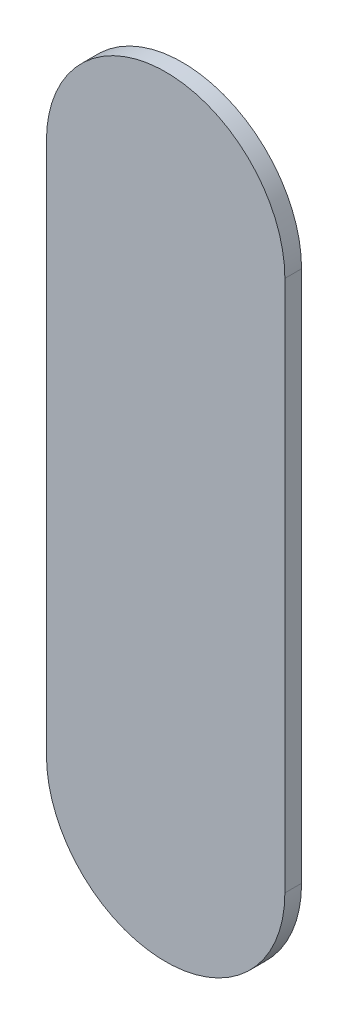
ISO-10303-21;
HEADER;
FILE_DESCRIPTION(('STEP AP214'),'2;1');
FILE_NAME('part.step','',(''),(''),'','','');
FILE_SCHEMA(('AUTOMOTIVE_DESIGN { 1 0 10303 214 1 1 1 1 }'));
ENDSEC;
DATA;
#1=APPLICATION_CONTEXT('core data for automotive mechanical design processes');
#2=APPLICATION_PROTOCOL_DEFINITION('international standard','automotive_design',2000,#1);
#3=PRODUCT_CONTEXT('',#1,'mechanical');
#4=PRODUCT('Part','Part','',(#3));
#5=PRODUCT_RELATED_PRODUCT_CATEGORY('part','',(#4));
#6=PRODUCT_DEFINITION_FORMATION('','',#4);
#7=PRODUCT_DEFINITION_CONTEXT('part definition',#1,'design');
#8=PRODUCT_DEFINITION('design','',#6,#7);
#9=PRODUCT_DEFINITION_SHAPE('','',#8);
#10=(LENGTH_UNIT() NAMED_UNIT(*) SI_UNIT(.MILLI.,.METRE.));
#11=(NAMED_UNIT(*) PLANE_ANGLE_UNIT() SI_UNIT($,.RADIAN.));
#12=(NAMED_UNIT(*) SI_UNIT($,.STERADIAN.) SOLID_ANGLE_UNIT());
#13=UNCERTAINTY_MEASURE_WITH_UNIT(LENGTH_MEASURE(1.E-05),#10,'distance_accuracy_value','');
#14=(GEOMETRIC_REPRESENTATION_CONTEXT(3) GLOBAL_UNCERTAINTY_ASSIGNED_CONTEXT((#13)) GLOBAL_UNIT_ASSIGNED_CONTEXT((#10,
#11,#12)) REPRESENTATION_CONTEXT('',''));
#15=CARTESIAN_POINT('',(0.,0.,0.));
#16=DIRECTION('',(0.,0.,1.));
#17=DIRECTION('',(1.,0.,0.));
#18=AXIS2_PLACEMENT_3D('',#15,#16,#17);
#19=CARTESIAN_POINT('',(109.669,-72.989,1.635));
#20=DIRECTION('',(0.,0.,1.));
#21=DIRECTION('',(1.,0.,0.));
#22=AXIS2_PLACEMENT_3D('',#19,#20,#21);
#23=PLANE('',#22);
#24=DIRECTION('',(0.,-1.,0.));
#25=VECTOR('',#24,1.);
#26=CARTESIAN_POINT('',(109.669,-72.989,1.635));
#27=LINE('',#26,#25);
#28=CARTESIAN_POINT('',(109.669,-72.989,1.635));
#29=VERTEX_POINT('',#28);
#30=CARTESIAN_POINT('',(109.669,-74.105,1.635));
#31=VERTEX_POINT('',#30);
#32=EDGE_CURVE('E82',#29,#31,#27,.T.);
#33=ORIENTED_EDGE('',*,*,#32,.T.);
#34=CARTESIAN_POINT('',(109.919,-74.105,1.635));
#35=DIRECTION('',(0.,0.,1.));
#36=DIRECTION('',(-1.,0.,0.));
#37=AXIS2_PLACEMENT_3D('',#34,#35,#36);
#38=CIRCLE('',#37,0.25);
#39=CARTESIAN_POINT('',(110.169,-74.105,1.635));
#40=VERTEX_POINT('',#39);
#41=EDGE_CURVE('E107',#31,#40,#38,.T.);
#42=ORIENTED_EDGE('',*,*,#41,.T.);
#43=DIRECTION('',(0.,1.,0.));
#44=VECTOR('',#43,1.);
#45=CARTESIAN_POINT('',(110.169,-74.105,1.635));
#46=LINE('',#45,#44);
#47=CARTESIAN_POINT('',(110.169,-72.989,1.635));
#48=VERTEX_POINT('',#47);
#49=EDGE_CURVE('E74',#40,#48,#46,.T.);
#50=ORIENTED_EDGE('',*,*,#49,.T.);
#51=CARTESIAN_POINT('',(109.919,-72.989,1.635));
#52=DIRECTION('',(0.,0.,1.));
#53=DIRECTION('',(1.,0.,0.));
#54=AXIS2_PLACEMENT_3D('',#51,#52,#53);
#55=CIRCLE('',#54,0.25);
#56=EDGE_CURVE('E11',#48,#29,#55,.T.);
#57=ORIENTED_EDGE('',*,*,#56,.T.);
#58=EDGE_LOOP('',(#33,#42,#50,#57));
#59=FACE_BOUND('',#58,.T.);
#60=ADVANCED_FACE('F17',(#59),#23,.T.);
#61=CARTESIAN_POINT('',(109.669,-72.989,1.6));
#62=DIRECTION('',(0.,0.,1.));
#63=DIRECTION('',(1.,0.,0.));
#64=AXIS2_PLACEMENT_3D('',#61,#62,#63);
#65=PLANE('',#64);
#66=CARTESIAN_POINT('',(109.919,-72.989,1.6));
#67=DIRECTION('',(0.,0.,1.));
#68=DIRECTION('',(1.,0.,0.));
#69=AXIS2_PLACEMENT_3D('',#66,#67,#68);
#70=CIRCLE('',#69,0.25);
#71=CARTESIAN_POINT('',(110.169,-72.989,1.6));
#72=VERTEX_POINT('',#71);
#73=CARTESIAN_POINT('',(109.669,-72.989,1.6));
#74=VERTEX_POINT('',#73);
#75=EDGE_CURVE('E25',#72,#74,#70,.T.);
#76=ORIENTED_EDGE('',*,*,#75,.F.);
#77=DIRECTION('',(0.,1.,0.));
#78=VECTOR('',#77,1.);
#79=CARTESIAN_POINT('',(110.169,-74.105,1.6));
#80=LINE('',#79,#78);
#81=CARTESIAN_POINT('',(110.169,-74.105,1.6));
#82=VERTEX_POINT('',#81);
#83=EDGE_CURVE('E101',#82,#72,#80,.T.);
#84=ORIENTED_EDGE('',*,*,#83,.F.);
#85=CARTESIAN_POINT('',(109.919,-74.105,1.6));
#86=DIRECTION('',(0.,0.,1.));
#87=DIRECTION('',(-1.,0.,0.));
#88=AXIS2_PLACEMENT_3D('',#85,#86,#87);
#89=CIRCLE('',#88,0.25);
#90=CARTESIAN_POINT('',(109.669,-74.105,1.6));
#91=VERTEX_POINT('',#90);
#92=EDGE_CURVE('E84',#91,#82,#89,.T.);
#93=ORIENTED_EDGE('',*,*,#92,.F.);
#94=DIRECTION('',(0.,-1.,0.));
#95=VECTOR('',#94,1.);
#96=CARTESIAN_POINT('',(109.669,-72.989,1.6));
#97=LINE('',#96,#95);
#98=EDGE_CURVE('E80',#74,#91,#97,.T.);
#99=ORIENTED_EDGE('',*,*,#98,.F.);
#100=EDGE_LOOP('',(#76,#84,#93,#99));
#101=FACE_BOUND('',#100,.T.);
#102=ADVANCED_FACE('F86',(#101),#65,.F.);
#103=CARTESIAN_POINT('',(109.919,-72.989,1.6));
#104=DIRECTION('',(0.,0.,-1.));
#105=DIRECTION('',(1.,0.,0.));
#106=AXIS2_PLACEMENT_3D('',#103,#104,#105);
#107=CYLINDRICAL_SURFACE('',#106,0.25);
#108=ORIENTED_EDGE('',*,*,#75,.T.);
#109=DIRECTION('',(0.,0.,1.));
#110=VECTOR('',#109,1.);
#111=CARTESIAN_POINT('',(109.669,-72.989,1.6));
#112=LINE('',#111,#110);
#113=EDGE_CURVE('E68',#74,#29,#112,.T.);
#114=ORIENTED_EDGE('',*,*,#113,.T.);
#115=ORIENTED_EDGE('',*,*,#56,.F.);
#116=DIRECTION('',(0.,0.,1.));
#117=VECTOR('',#116,1.);
#118=CARTESIAN_POINT('',(110.169,-72.989,1.6));
#119=LINE('',#118,#117);
#120=EDGE_CURVE('E71',#72,#48,#119,.T.);
#121=ORIENTED_EDGE('',*,*,#120,.F.);
#122=EDGE_LOOP('',(#108,#114,#115,#121));
#123=FACE_BOUND('',#122,.T.);
#124=ADVANCED_FACE('F67',(#123),#107,.T.);
#125=CARTESIAN_POINT('',(110.169,-74.105,1.6));
#126=DIRECTION('',(-1.,0.,0.));
#127=DIRECTION('',(0.,0.,1.));
#128=AXIS2_PLACEMENT_3D('',#125,#126,#127);
#129=PLANE('',#128);
#130=ORIENTED_EDGE('',*,*,#83,.T.);
#131=ORIENTED_EDGE('',*,*,#120,.T.);
#132=ORIENTED_EDGE('',*,*,#49,.F.);
#133=DIRECTION('',(0.,0.,1.));
#134=VECTOR('',#133,1.);
#135=CARTESIAN_POINT('',(110.169,-74.105,1.6));
#136=LINE('',#135,#134);
#137=EDGE_CURVE('E110',#82,#40,#136,.T.);
#138=ORIENTED_EDGE('',*,*,#137,.F.);
#139=EDGE_LOOP('',(#130,#131,#132,#138));
#140=FACE_BOUND('',#139,.T.);
#141=ADVANCED_FACE('F122',(#140),#129,.F.);
#142=CARTESIAN_POINT('',(109.919,-74.105,1.6));
#143=DIRECTION('',(0.,0.,-1.));
#144=DIRECTION('',(-1.,0.,0.));
#145=AXIS2_PLACEMENT_3D('',#142,#143,#144);
#146=CYLINDRICAL_SURFACE('',#145,0.25);
#147=ORIENTED_EDGE('',*,*,#92,.T.);
#148=ORIENTED_EDGE('',*,*,#137,.T.);
#149=ORIENTED_EDGE('',*,*,#41,.F.);
#150=DIRECTION('',(0.,0.,1.));
#151=VECTOR('',#150,1.);
#152=CARTESIAN_POINT('',(109.669,-74.105,1.6));
#153=LINE('',#152,#151);
#154=EDGE_CURVE('E90',#91,#31,#153,.T.);
#155=ORIENTED_EDGE('',*,*,#154,.F.);
#156=EDGE_LOOP('',(#147,#148,#149,#155));
#157=FACE_BOUND('',#156,.T.);
#158=ADVANCED_FACE('F120',(#157),#146,.T.);
#159=CARTESIAN_POINT('',(109.669,-72.989,1.6));
#160=DIRECTION('',(1.,0.,0.));
#161=DIRECTION('',(0.,1.,0.));
#162=AXIS2_PLACEMENT_3D('',#159,#160,#161);
#163=PLANE('',#162);
#164=ORIENTED_EDGE('',*,*,#98,.T.);
#165=ORIENTED_EDGE('',*,*,#154,.T.);
#166=ORIENTED_EDGE('',*,*,#32,.F.);
#167=ORIENTED_EDGE('',*,*,#113,.F.);
#168=EDGE_LOOP('',(#164,#165,#166,#167));
#169=FACE_BOUND('',#168,.T.);
#170=ADVANCED_FACE('F78',(#169),#163,.F.);
#171=CLOSED_SHELL('',(#60,#102,#124,#141,#158,#170));
#172=MANIFOLD_SOLID_BREP('B1',#171);
#173=ADVANCED_BREP_SHAPE_REPRESENTATION('',(#18,#172),#14);
#174=SHAPE_DEFINITION_REPRESENTATION(#9,#173);
ENDSEC;
END-ISO-10303-21;
